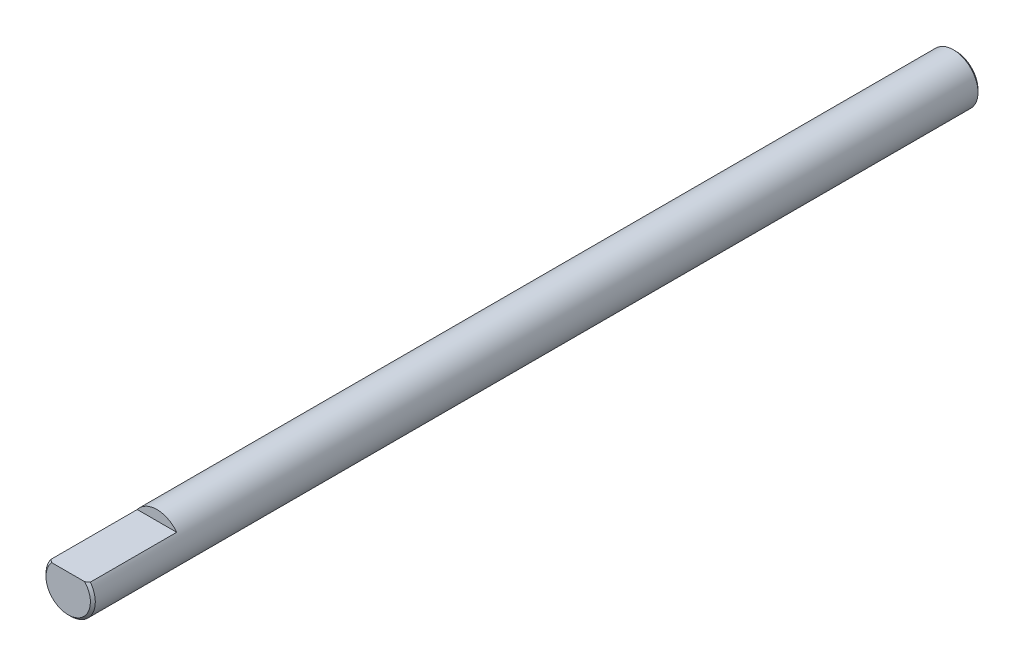
ISO-10303-21;
HEADER;
FILE_DESCRIPTION(('STEP AP214'),'2;1');
FILE_NAME('part.step','',(''),(''),'','','');
FILE_SCHEMA(('AUTOMOTIVE_DESIGN { 1 0 10303 214 1 1 1 1 }'));
ENDSEC;
DATA;
#1=APPLICATION_CONTEXT('core data for automotive mechanical design processes');
#2=APPLICATION_PROTOCOL_DEFINITION('international standard','automotive_design',2000,#1);
#3=PRODUCT_CONTEXT('',#1,'mechanical');
#4=PRODUCT('Part','Part','',(#3));
#5=PRODUCT_RELATED_PRODUCT_CATEGORY('part','',(#4));
#6=PRODUCT_DEFINITION_FORMATION('','',#4);
#7=PRODUCT_DEFINITION_CONTEXT('part definition',#1,'design');
#8=PRODUCT_DEFINITION('design','',#6,#7);
#9=PRODUCT_DEFINITION_SHAPE('','',#8);
#10=(LENGTH_UNIT() NAMED_UNIT(*) SI_UNIT(.MILLI.,.METRE.));
#11=(NAMED_UNIT(*) PLANE_ANGLE_UNIT() SI_UNIT($,.RADIAN.));
#12=(NAMED_UNIT(*) SI_UNIT($,.STERADIAN.) SOLID_ANGLE_UNIT());
#13=UNCERTAINTY_MEASURE_WITH_UNIT(LENGTH_MEASURE(1.E-05),#10,'distance_accuracy_value','');
#14=(GEOMETRIC_REPRESENTATION_CONTEXT(3) GLOBAL_UNCERTAINTY_ASSIGNED_CONTEXT((#13)) GLOBAL_UNIT_ASSIGNED_CONTEXT((#10,
#11,#12)) REPRESENTATION_CONTEXT('',''));
#15=CARTESIAN_POINT('',(0.,0.,0.));
#16=DIRECTION('',(0.,0.,1.));
#17=DIRECTION('',(1.,0.,0.));
#18=AXIS2_PLACEMENT_3D('',#15,#16,#17);
#19=CARTESIAN_POINT('',(0.,0.,90.));
#20=DIRECTION('',(0.,0.,-1.));
#21=DIRECTION('',(-1.,0.,0.));
#22=AXIS2_PLACEMENT_3D('',#19,#20,#21);
#23=CYLINDRICAL_SURFACE('',#22,2.5);
#24=CARTESIAN_POINT('',(0.,0.,0.250000000000056));
#25=DIRECTION('',(0.,0.,1.));
#26=DIRECTION('',(1.,0.,0.));
#27=AXIS2_PLACEMENT_3D('',#24,#25,#26);
#28=CIRCLE('',#27,2.5);
#29=CARTESIAN_POINT('',(2.5,0.,0.250000000000056));
#30=VERTEX_POINT('',#29);
#31=EDGE_CURVE('E96',#30,#30,#28,.T.);
#32=ORIENTED_EDGE('',*,*,#31,.T.);
#33=EDGE_LOOP('',(#32));
#34=FACE_BOUND('',#33,.T.);
#35=DIRECTION('',(0.,0.,-1.));
#36=VECTOR('',#35,1.);
#37=CARTESIAN_POINT('',(2.,1.5,90.));
#38=LINE('',#37,#36);
#39=CARTESIAN_POINT('',(2.,1.5,81.));
#40=VERTEX_POINT('',#39);
#41=CARTESIAN_POINT('',(2.,1.5,89.7500000000001));
#42=VERTEX_POINT('',#41);
#43=EDGE_CURVE('E83',#40,#42,#38,.F.);
#44=ORIENTED_EDGE('',*,*,#43,.T.);
#45=CARTESIAN_POINT('',(0.,0.,89.7500000000001));
#46=DIRECTION('',(0.,0.,1.));
#47=DIRECTION('',(1.,0.,0.));
#48=AXIS2_PLACEMENT_3D('',#45,#46,#47);
#49=CIRCLE('',#48,2.5);
#50=CARTESIAN_POINT('',(-2.,1.5,89.7500000000001));
#51=VERTEX_POINT('',#50);
#52=EDGE_CURVE('E80',#42,#51,#49,.F.);
#53=ORIENTED_EDGE('',*,*,#52,.T.);
#54=DIRECTION('',(0.,0.,-1.));
#55=VECTOR('',#54,1.);
#56=CARTESIAN_POINT('',(-2.,1.5,90.));
#57=LINE('',#56,#55);
#58=CARTESIAN_POINT('',(-2.,1.5,81.));
#59=VERTEX_POINT('',#58);
#60=EDGE_CURVE('E75',#51,#59,#57,.T.);
#61=ORIENTED_EDGE('',*,*,#60,.T.);
#62=CARTESIAN_POINT('',(0.,0.,81.));
#63=DIRECTION('',(0.,0.,1.));
#64=DIRECTION('',(1.,0.,0.));
#65=AXIS2_PLACEMENT_3D('',#62,#63,#64);
#66=CIRCLE('',#65,2.5);
#67=EDGE_CURVE('E78',#40,#59,#66,.T.);
#68=ORIENTED_EDGE('',*,*,#67,.F.);
#69=EDGE_LOOP('',(#44,#53,#61,#68));
#70=FACE_BOUND('',#69,.T.);
#71=ADVANCED_FACE('F35',(#34,#70),#23,.T.);
#72=CARTESIAN_POINT('',(0.,0.,90.));
#73=DIRECTION('',(0.,0.,1.));
#74=DIRECTION('',(1.,0.,0.));
#75=AXIS2_PLACEMENT_3D('',#72,#73,#74);
#76=PLANE('',#75);
#77=DIRECTION('',(1.,0.,0.));
#78=VECTOR('',#77,1.);
#79=CARTESIAN_POINT('',(0.,1.5,90.));
#80=LINE('',#79,#78);
#81=CARTESIAN_POINT('',(-1.67705098312492,1.5,90.));
#82=VERTEX_POINT('',#81);
#83=CARTESIAN_POINT('',(1.67705098312492,1.5,90.));
#84=VERTEX_POINT('',#83);
#85=EDGE_CURVE('E82',#82,#84,#80,.T.);
#86=ORIENTED_EDGE('',*,*,#85,.F.);
#87=CARTESIAN_POINT('',(0.,0.,90.));
#88=DIRECTION('',(0.,0.,1.));
#89=DIRECTION('',(1.,0.,0.));
#90=AXIS2_PLACEMENT_3D('',#87,#88,#89);
#91=CIRCLE('',#90,2.25000000000006);
#92=EDGE_CURVE('E102',#82,#84,#91,.T.);
#93=ORIENTED_EDGE('',*,*,#92,.T.);
#94=EDGE_LOOP('',(#86,#93));
#95=FACE_BOUND('',#94,.T.);
#96=ADVANCED_FACE('F112',(#95),#76,.T.);
#97=CARTESIAN_POINT('',(0.,0.,0.));
#98=DIRECTION('',(0.,0.,1.));
#99=DIRECTION('',(1.,0.,0.));
#100=AXIS2_PLACEMENT_3D('',#97,#98,#99);
#101=PLANE('',#100);
#102=CARTESIAN_POINT('',(0.,0.,0.));
#103=DIRECTION('',(0.,0.,1.));
#104=DIRECTION('',(1.,0.,0.));
#105=AXIS2_PLACEMENT_3D('',#102,#103,#104);
#106=CIRCLE('',#105,2.24999999999994);
#107=CARTESIAN_POINT('',(2.24999999999994,0.,0.));
#108=VERTEX_POINT('',#107);
#109=EDGE_CURVE('E99',#108,#108,#106,.F.);
#110=ORIENTED_EDGE('',*,*,#109,.T.);
#111=EDGE_LOOP('',(#110));
#112=FACE_BOUND('',#111,.T.);
#113=ADVANCED_FACE('F116',(#112),#101,.F.);
#114=CARTESIAN_POINT('',(0.,0.,81.));
#115=DIRECTION('',(0.,0.,1.));
#116=DIRECTION('',(1.,0.,0.));
#117=AXIS2_PLACEMENT_3D('',#114,#115,#116);
#118=PLANE('',#117);
#119=DIRECTION('',(1.,0.,0.));
#120=VECTOR('',#119,1.);
#121=CARTESIAN_POINT('',(-4.02282758063212,1.5,81.));
#122=LINE('',#121,#120);
#123=EDGE_CURVE('E88',#59,#40,#122,.T.);
#124=ORIENTED_EDGE('',*,*,#123,.T.);
#125=ORIENTED_EDGE('',*,*,#67,.T.);
#126=EDGE_LOOP('',(#124,#125));
#127=FACE_BOUND('',#126,.T.);
#128=ADVANCED_FACE('F87',(#127),#118,.T.);
#129=CARTESIAN_POINT('',(-4.02282758063212,1.5,81.));
#130=DIRECTION('',(0.,-1.,0.));
#131=DIRECTION('',(0.,0.,-1.));
#132=AXIS2_PLACEMENT_3D('',#129,#130,#131);
#133=PLANE('',#132);
#134=ORIENTED_EDGE('',*,*,#85,.T.);
#135=CARTESIAN_POINT('',(1.67705098312492,1.5,90.));
#136=CARTESIAN_POINT('',(1.70434100742454,1.5,89.9796583179149));
#137=CARTESIAN_POINT('',(1.73152590412875,1.5,89.9591761368108));
#138=CARTESIAN_POINT('',(1.78570028815997,1.5,89.9179589412329));
#139=CARTESIAN_POINT('',(1.81268978954971,1.5,89.8972239452487));
#140=CARTESIAN_POINT('',(1.86649188986873,1.5,89.8555265531804));
#141=CARTESIAN_POINT('',(1.89330449078071,1.5,89.8345641596519));
#142=CARTESIAN_POINT('',(1.94676938855198,1.5,89.7924319004935));
#143=CARTESIAN_POINT('',(1.97342167361996,1.5,89.7712620198968));
#144=CARTESIAN_POINT('',(2.00000000000001,1.5,89.7500000000001));
#145=B_SPLINE_CURVE_WITH_KNOTS('',3,(#135,#136,#137,#138,#139,#140,#141,#142,#143,#144),
.UNSPECIFIED.,.F.,.F.,(4,2,2,2,4),(0.,0.102110617528209,0.204213811523881,0.306315859190344,
0.408425326869503),.UNSPECIFIED.);
#146=EDGE_CURVE('E11',#84,#42,#145,.T.);
#147=ORIENTED_EDGE('',*,*,#146,.T.);
#148=ORIENTED_EDGE('',*,*,#43,.F.);
#149=ORIENTED_EDGE('',*,*,#123,.F.);
#150=ORIENTED_EDGE('',*,*,#60,.F.);
#151=CARTESIAN_POINT('',(-2.,1.5,89.7500000000001));
#152=CARTESIAN_POINT('',(-1.97342167361995,1.5,89.7712620198968));
#153=CARTESIAN_POINT('',(-1.94676938855197,1.5,89.7924319004935));
#154=CARTESIAN_POINT('',(-1.89330449078071,1.5,89.8345641596519));
#155=CARTESIAN_POINT('',(-1.86649188986874,1.5,89.8555265531804));
#156=CARTESIAN_POINT('',(-1.81268978954972,1.5,89.8972239452487));
#157=CARTESIAN_POINT('',(-1.78570028815997,1.5,89.9179589412329));
#158=CARTESIAN_POINT('',(-1.73152590412877,1.5,89.9591761368108));
#159=CARTESIAN_POINT('',(-1.70434100742456,1.5,89.979658317915));
#160=CARTESIAN_POINT('',(-1.67705098312495,1.5,90.));
#161=B_SPLINE_CURVE_WITH_KNOTS('',3,(#151,#152,#153,#154,#155,#156,#157,#158,#159,#160),
.UNSPECIFIED.,.F.,.F.,(4,2,2,2,4),(0.,0.102109467679154,0.204211515345616,0.306314709341282,
0.408425326869499),.UNSPECIFIED.);
#162=EDGE_CURVE('E50',#51,#82,#161,.T.);
#163=ORIENTED_EDGE('',*,*,#162,.T.);
#164=EDGE_LOOP('',(#134,#147,#148,#149,#150,#163));
#165=FACE_BOUND('',#164,.T.);
#166=ADVANCED_FACE('F90',(#165),#133,.F.);
#167=CARTESIAN_POINT('',(0.,0.,0.250000000000056));
#168=DIRECTION('',(0.,0.,1.));
#169=DIRECTION('',(1.,0.,0.));
#170=AXIS2_PLACEMENT_3D('',#167,#168,#169);
#171=CONICAL_SURFACE('',#170,2.5,0.785398163397458);
#172=ORIENTED_EDGE('',*,*,#109,.F.);
#173=EDGE_LOOP('',(#172));
#174=FACE_BOUND('',#173,.T.);
#175=ORIENTED_EDGE('',*,*,#31,.F.);
#176=EDGE_LOOP('',(#175));
#177=FACE_BOUND('',#176,.T.);
#178=ADVANCED_FACE('F111',(#174,#177),#171,.T.);
#179=CARTESIAN_POINT('',(0.,0.,90.));
#180=DIRECTION('',(0.,0.,-1.));
#181=DIRECTION('',(-1.,0.,0.));
#182=AXIS2_PLACEMENT_3D('',#179,#180,#181);
#183=CONICAL_SURFACE('',#182,2.25000000000006,0.785398163397444);
#184=ORIENTED_EDGE('',*,*,#162,.F.);
#185=ORIENTED_EDGE('',*,*,#52,.F.);
#186=ORIENTED_EDGE('',*,*,#146,.F.);
#187=ORIENTED_EDGE('',*,*,#92,.F.);
#188=EDGE_LOOP('',(#184,#185,#186,#187));
#189=FACE_BOUND('',#188,.T.);
#190=ADVANCED_FACE('F38',(#189),#183,.T.);
#191=CLOSED_SHELL('',(#71,#96,#113,#128,#166,#178,#190));
#192=MANIFOLD_SOLID_BREP('B2',#191);
#193=ADVANCED_BREP_SHAPE_REPRESENTATION('',(#18,#192),#14);
#194=SHAPE_DEFINITION_REPRESENTATION(#9,#193);
ENDSEC;
END-ISO-10303-21;
